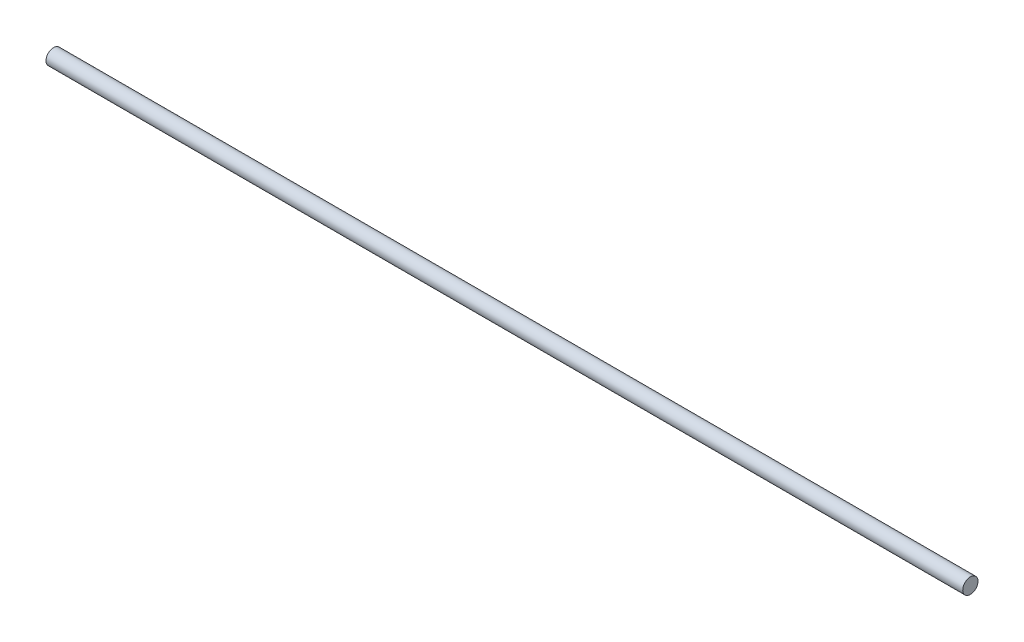
ISO-10303-21;
HEADER;
FILE_DESCRIPTION(('STEP AP214'),'2;1');
FILE_NAME('part.step','',(''),(''),'','','');
FILE_SCHEMA(('AUTOMOTIVE_DESIGN { 1 0 10303 214 1 1 1 1 }'));
ENDSEC;
DATA;
#1=APPLICATION_CONTEXT('core data for automotive mechanical design processes');
#2=APPLICATION_PROTOCOL_DEFINITION('international standard','automotive_design',2000,#1);
#3=PRODUCT_CONTEXT('',#1,'mechanical');
#4=PRODUCT('Part','Part','',(#3));
#5=PRODUCT_RELATED_PRODUCT_CATEGORY('part','',(#4));
#6=PRODUCT_DEFINITION_FORMATION('','',#4);
#7=PRODUCT_DEFINITION_CONTEXT('part definition',#1,'design');
#8=PRODUCT_DEFINITION('design','',#6,#7);
#9=PRODUCT_DEFINITION_SHAPE('','',#8);
#10=(LENGTH_UNIT() NAMED_UNIT(*) SI_UNIT(.MILLI.,.METRE.));
#11=(NAMED_UNIT(*) PLANE_ANGLE_UNIT() SI_UNIT($,.RADIAN.));
#12=(NAMED_UNIT(*) SI_UNIT($,.STERADIAN.) SOLID_ANGLE_UNIT());
#13=UNCERTAINTY_MEASURE_WITH_UNIT(LENGTH_MEASURE(1.E-05),#10,'distance_accuracy_value','');
#14=(GEOMETRIC_REPRESENTATION_CONTEXT(3) GLOBAL_UNCERTAINTY_ASSIGNED_CONTEXT((#13)) GLOBAL_UNIT_ASSIGNED_CONTEXT((#10,
#11,#12)) REPRESENTATION_CONTEXT('',''));
#15=CARTESIAN_POINT('',(0.,0.,0.));
#16=DIRECTION('',(0.,0.,1.));
#17=DIRECTION('',(1.,0.,0.));
#18=AXIS2_PLACEMENT_3D('',#15,#16,#17);
#19=CARTESIAN_POINT('',(180.,0.,0.));
#20=DIRECTION('',(-1.,0.,0.));
#21=DIRECTION('',(0.,0.,1.));
#22=AXIS2_PLACEMENT_3D('',#19,#20,#21);
#23=CYLINDRICAL_SURFACE('',#22,1.5);
#24=CARTESIAN_POINT('',(180.,0.,0.));
#25=DIRECTION('',(1.,0.,0.));
#26=DIRECTION('',(0.,0.,-1.));
#27=AXIS2_PLACEMENT_3D('',#24,#25,#26);
#28=CIRCLE('',#27,1.5);
#29=CARTESIAN_POINT('',(180.,0.,1.5));
#30=VERTEX_POINT('',#29);
#31=EDGE_CURVE('E10',#30,#30,#28,.T.);
#32=CARTESIAN_POINT('',(0.,0.,0.));
#33=DIRECTION('',(1.,0.,0.));
#34=DIRECTION('',(0.,0.,-1.));
#35=AXIS2_PLACEMENT_3D('',#32,#33,#34);
#36=CIRCLE('',#35,1.5);
#37=CARTESIAN_POINT('',(0.,0.,1.5));
#38=VERTEX_POINT('',#37);
#39=EDGE_CURVE('E34',#38,#38,#36,.T.);
#40=CARTESIAN_POINT('',(180.,0.,1.5));
#41=CARTESIAN_POINT('',(178.125,0.,1.5));
#42=CARTESIAN_POINT('',(176.25,0.,1.5));
#43=CARTESIAN_POINT('',(172.5,0.,1.5));
#44=CARTESIAN_POINT('',(170.625,0.,1.5));
#45=CARTESIAN_POINT('',(166.875,0.,1.5));
#46=CARTESIAN_POINT('',(165.,0.,1.5));
#47=CARTESIAN_POINT('',(161.25,0.,1.5));
#48=CARTESIAN_POINT('',(159.375,0.,1.5));
#49=CARTESIAN_POINT('',(155.625,0.,1.5));
#50=CARTESIAN_POINT('',(153.75,0.,1.5));
#51=CARTESIAN_POINT('',(150.,0.,1.5));
#52=CARTESIAN_POINT('',(148.125,0.,1.5));
#53=CARTESIAN_POINT('',(144.375,0.,1.5));
#54=CARTESIAN_POINT('',(142.5,0.,1.5));
#55=CARTESIAN_POINT('',(138.75,0.,1.5));
#56=CARTESIAN_POINT('',(136.875,0.,1.5));
#57=CARTESIAN_POINT('',(133.125,0.,1.5));
#58=CARTESIAN_POINT('',(131.25,0.,1.5));
#59=CARTESIAN_POINT('',(127.5,0.,1.5));
#60=CARTESIAN_POINT('',(125.625,0.,1.5));
#61=CARTESIAN_POINT('',(121.875,0.,1.5));
#62=CARTESIAN_POINT('',(120.,0.,1.5));
#63=CARTESIAN_POINT('',(116.25,0.,1.5));
#64=CARTESIAN_POINT('',(114.375,0.,1.5));
#65=CARTESIAN_POINT('',(110.625,0.,1.5));
#66=CARTESIAN_POINT('',(108.75,0.,1.5));
#67=CARTESIAN_POINT('',(105.,0.,1.5));
#68=CARTESIAN_POINT('',(103.125,0.,1.5));
#69=CARTESIAN_POINT('',(99.375,0.,1.5));
#70=CARTESIAN_POINT('',(97.5,0.,1.5));
#71=CARTESIAN_POINT('',(93.75,0.,1.5));
#72=CARTESIAN_POINT('',(91.875,0.,1.5));
#73=CARTESIAN_POINT('',(88.125,0.,1.5));
#74=CARTESIAN_POINT('',(86.25,0.,1.5));
#75=CARTESIAN_POINT('',(82.5,0.,1.5));
#76=CARTESIAN_POINT('',(80.625,0.,1.5));
#77=CARTESIAN_POINT('',(76.875,0.,1.5));
#78=CARTESIAN_POINT('',(75.,0.,1.5));
#79=CARTESIAN_POINT('',(71.25,0.,1.5));
#80=CARTESIAN_POINT('',(69.375,0.,1.5));
#81=CARTESIAN_POINT('',(65.625,0.,1.5));
#82=CARTESIAN_POINT('',(63.75,0.,1.5));
#83=CARTESIAN_POINT('',(60.,0.,1.5));
#84=CARTESIAN_POINT('',(58.125,0.,1.5));
#85=CARTESIAN_POINT('',(54.375,0.,1.5));
#86=CARTESIAN_POINT('',(52.5,0.,1.5));
#87=CARTESIAN_POINT('',(48.75,0.,1.5));
#88=CARTESIAN_POINT('',(46.875,0.,1.5));
#89=CARTESIAN_POINT('',(43.125,0.,1.5));
#90=CARTESIAN_POINT('',(41.25,0.,1.5));
#91=CARTESIAN_POINT('',(37.5,0.,1.5));
#92=CARTESIAN_POINT('',(35.625,0.,1.5));
#93=CARTESIAN_POINT('',(31.875,0.,1.5));
#94=CARTESIAN_POINT('',(30.,0.,1.5));
#95=CARTESIAN_POINT('',(26.25,0.,1.5));
#96=CARTESIAN_POINT('',(24.375,0.,1.5));
#97=CARTESIAN_POINT('',(20.625,0.,1.5));
#98=CARTESIAN_POINT('',(18.75,0.,1.5));
#99=CARTESIAN_POINT('',(15.,0.,1.5));
#100=CARTESIAN_POINT('',(13.125,0.,1.5));
#101=CARTESIAN_POINT('',(9.37499999999998,0.,1.5));
#102=CARTESIAN_POINT('',(7.49999999999997,0.,1.5));
#103=CARTESIAN_POINT('',(3.74999999999997,0.,1.5));
#104=CARTESIAN_POINT('',(1.87499999999997,0.,1.5));
#105=CARTESIAN_POINT('',(0.,0.,1.5));
#106=B_SPLINE_CURVE_WITH_KNOTS('',3,(#40,#41,#42,#43,#44,#45,#46,#47,#48,#49,#50,#51,#52,#53,
#54,#55,#56,#57,#58,#59,#60,#61,#62,#63,#64,#65,#66,#67,#68,#69,#70,#71,#72,#73,#74,#75,#76,#77,
#78,#79,#80,#81,#82,#83,#84,#85,#86,#87,#88,#89,#90,#91,#92,#93,#94,#95,#96,#97,#98,#99,#100,
#101,#102,#103,#104,#105),.UNSPECIFIED.,.F.,.F.,(4,2,2,2,2,2,2,2,2,2,2,2,2,2,2,2,2,2,2,2,2,2,2,
2,2,2,2,2,2,2,2,2,4),(0.,5.62500000000002,11.25,16.875,22.5,28.125,33.75,39.375,45.,50.625,
56.25,61.875,67.5,73.125,78.75,84.375,90.,95.625,101.25,106.875,112.5,118.125,123.75,129.375,
135.,140.625,146.25,151.875,157.5,163.125,168.75,174.375,180.),.UNSPECIFIED.);
#107=EDGE_CURVE('BSEAM31',#30,#38,#106,.T.);
#108=ORIENTED_EDGE('',*,*,#31,.F.);
#109=ORIENTED_EDGE('',*,*,#39,.T.);
#110=ORIENTED_EDGE('',*,*,#107,.T.);
#111=ORIENTED_EDGE('',*,*,#107,.F.);
#112=EDGE_LOOP('',(#108,#110,#109,#111));
#113=FACE_BOUND('',#112,.T.);
#114=ADVANCED_FACE('F31',(#113),#23,.T.);
#115=CARTESIAN_POINT('',(180.,0.,0.));
#116=DIRECTION('',(1.,0.,0.));
#117=DIRECTION('',(0.,0.,-1.));
#118=AXIS2_PLACEMENT_3D('',#115,#116,#117);
#119=PLANE('',#118);
#120=ORIENTED_EDGE('',*,*,#31,.T.);
#121=EDGE_LOOP('',(#120));
#122=FACE_BOUND('',#121,.T.);
#123=ADVANCED_FACE('F46',(#122),#119,.T.);
#124=CARTESIAN_POINT('',(0.,0.,0.));
#125=DIRECTION('',(1.,0.,0.));
#126=DIRECTION('',(0.,0.,-1.));
#127=AXIS2_PLACEMENT_3D('',#124,#125,#126);
#128=PLANE('',#127);
#129=ORIENTED_EDGE('',*,*,#39,.F.);
#130=EDGE_LOOP('',(#129));
#131=FACE_BOUND('',#130,.T.);
#132=ADVANCED_FACE('F44',(#131),#128,.F.);
#133=CLOSED_SHELL('',(#114,#123,#132));
#134=MANIFOLD_SOLID_BREP('B2',#133);
#135=ADVANCED_BREP_SHAPE_REPRESENTATION('',(#18,#134),#14);
#136=SHAPE_DEFINITION_REPRESENTATION(#9,#135);
ENDSEC;
END-ISO-10303-21;
